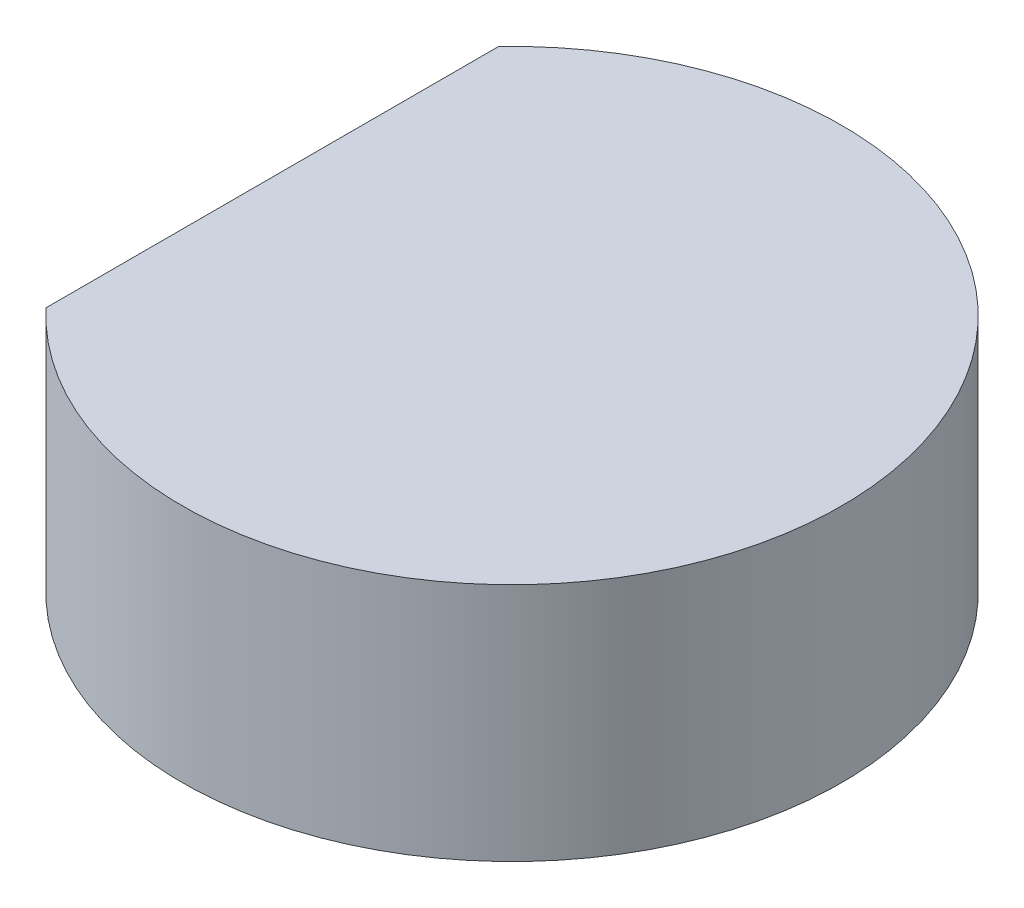
ISO-10303-21;
HEADER;
FILE_DESCRIPTION(('STEP AP214'),'2;1');
FILE_NAME('part.step','',(''),(''),'','','');
FILE_SCHEMA(('AUTOMOTIVE_DESIGN { 1 0 10303 214 1 1 1 1 }'));
ENDSEC;
DATA;
#1=APPLICATION_CONTEXT('core data for automotive mechanical design processes');
#2=APPLICATION_PROTOCOL_DEFINITION('international standard','automotive_design',2000,#1);
#3=PRODUCT_CONTEXT('',#1,'mechanical');
#4=PRODUCT('Part','Part','',(#3));
#5=PRODUCT_RELATED_PRODUCT_CATEGORY('part','',(#4));
#6=PRODUCT_DEFINITION_FORMATION('','',#4);
#7=PRODUCT_DEFINITION_CONTEXT('part definition',#1,'design');
#8=PRODUCT_DEFINITION('design','',#6,#7);
#9=PRODUCT_DEFINITION_SHAPE('','',#8);
#10=(LENGTH_UNIT() NAMED_UNIT(*) SI_UNIT(.MILLI.,.METRE.));
#11=(NAMED_UNIT(*) PLANE_ANGLE_UNIT() SI_UNIT($,.RADIAN.));
#12=(NAMED_UNIT(*) SI_UNIT($,.STERADIAN.) SOLID_ANGLE_UNIT());
#13=UNCERTAINTY_MEASURE_WITH_UNIT(LENGTH_MEASURE(1.E-05),#10,'distance_accuracy_value','');
#14=(GEOMETRIC_REPRESENTATION_CONTEXT(3) GLOBAL_UNCERTAINTY_ASSIGNED_CONTEXT((#13)) GLOBAL_UNIT_ASSIGNED_CONTEXT((#10,
#11,#12)) REPRESENTATION_CONTEXT('',''));
#15=CARTESIAN_POINT('',(0.,0.,0.));
#16=DIRECTION('',(0.,0.,1.));
#17=DIRECTION('',(1.,0.,0.));
#18=AXIS2_PLACEMENT_3D('',#15,#16,#17);
#19=CARTESIAN_POINT('',(0.,5.08,0.));
#20=DIRECTION('',(0.,-1.,0.));
#21=DIRECTION('',(0.,0.,-1.));
#22=AXIS2_PLACEMENT_3D('',#19,#20,#21);
#23=CYLINDRICAL_SURFACE('',#22,6.985);
#24=CARTESIAN_POINT('',(0.,5.08,0.));
#25=DIRECTION('',(0.,1.,0.));
#26=DIRECTION('',(0.,0.,1.));
#27=AXIS2_PLACEMENT_3D('',#24,#25,#26);
#28=CIRCLE('',#27,6.985);
#29=CARTESIAN_POINT('',(-5.08,5.08,4.79414486639693));
#30=VERTEX_POINT('',#29);
#31=CARTESIAN_POINT('',(-5.08,5.08,-4.79414486639693));
#32=VERTEX_POINT('',#31);
#33=EDGE_CURVE('E40',#30,#32,#28,.T.);
#34=ORIENTED_EDGE('',*,*,#33,.F.);
#35=DIRECTION('',(0.,-1.,0.));
#36=VECTOR('',#35,1.);
#37=CARTESIAN_POINT('',(-5.08,5.08,4.79414486639693));
#38=LINE('',#37,#36);
#39=CARTESIAN_POINT('',(-5.08,0.,4.79414486639693));
#40=VERTEX_POINT('',#39);
#41=EDGE_CURVE('E54',#30,#40,#38,.T.);
#42=ORIENTED_EDGE('',*,*,#41,.T.);
#43=CARTESIAN_POINT('',(0.,0.,0.));
#44=DIRECTION('',(0.,1.,0.));
#45=DIRECTION('',(0.,0.,1.));
#46=AXIS2_PLACEMENT_3D('',#43,#44,#45);
#47=CIRCLE('',#46,6.985);
#48=CARTESIAN_POINT('',(-5.08,0.,-4.79414486639693));
#49=VERTEX_POINT('',#48);
#50=EDGE_CURVE('E62',#40,#49,#47,.T.);
#51=ORIENTED_EDGE('',*,*,#50,.T.);
#52=DIRECTION('',(0.,-1.,0.));
#53=VECTOR('',#52,1.);
#54=CARTESIAN_POINT('',(-5.08,5.08,-4.79414486639693));
#55=LINE('',#54,#53);
#56=EDGE_CURVE('E47',#49,#32,#55,.F.);
#57=ORIENTED_EDGE('',*,*,#56,.T.);
#58=EDGE_LOOP('',(#34,#42,#51,#57));
#59=FACE_BOUND('',#58,.T.);
#60=ADVANCED_FACE('F33',(#59),#23,.T.);
#61=CARTESIAN_POINT('',(0.,5.08,0.));
#62=DIRECTION('',(0.,1.,0.));
#63=DIRECTION('',(0.,0.,1.));
#64=AXIS2_PLACEMENT_3D('',#61,#62,#63);
#65=PLANE('',#64);
#66=DIRECTION('',(0.,0.,-1.));
#67=VECTOR('',#66,1.);
#68=CARTESIAN_POINT('',(-5.08,5.08,6.35));
#69=LINE('',#68,#67);
#70=EDGE_CURVE('E57',#30,#32,#69,.T.);
#71=ORIENTED_EDGE('',*,*,#70,.F.);
#72=ORIENTED_EDGE('',*,*,#33,.T.);
#73=EDGE_LOOP('',(#71,#72));
#74=FACE_BOUND('',#73,.T.);
#75=ADVANCED_FACE('F66',(#74),#65,.T.);
#76=CARTESIAN_POINT('',(0.,0.,0.));
#77=DIRECTION('',(0.,1.,0.));
#78=DIRECTION('',(0.,0.,1.));
#79=AXIS2_PLACEMENT_3D('',#76,#77,#78);
#80=PLANE('',#79);
#81=ORIENTED_EDGE('',*,*,#50,.F.);
#82=DIRECTION('',(0.,0.,-1.));
#83=VECTOR('',#82,1.);
#84=CARTESIAN_POINT('',(-5.08,0.,0.));
#85=LINE('',#84,#83);
#86=EDGE_CURVE('E11',#40,#49,#85,.T.);
#87=ORIENTED_EDGE('',*,*,#86,.T.);
#88=EDGE_LOOP('',(#81,#87));
#89=FACE_BOUND('',#88,.T.);
#90=ADVANCED_FACE('F71',(#89),#80,.F.);
#91=CARTESIAN_POINT('',(-5.08,0.,6.35));
#92=DIRECTION('',(1.,0.,0.));
#93=DIRECTION('',(0.,0.,-1.));
#94=AXIS2_PLACEMENT_3D('',#91,#92,#93);
#95=PLANE('',#94);
#96=ORIENTED_EDGE('',*,*,#70,.T.);
#97=ORIENTED_EDGE('',*,*,#56,.F.);
#98=ORIENTED_EDGE('',*,*,#86,.F.);
#99=ORIENTED_EDGE('',*,*,#41,.F.);
#100=EDGE_LOOP('',(#96,#97,#98,#99));
#101=FACE_BOUND('',#100,.T.);
#102=ADVANCED_FACE('F56',(#101),#95,.F.);
#103=CLOSED_SHELL('',(#60,#75,#90,#102));
#104=MANIFOLD_SOLID_BREP('B2',#103);
#105=ADVANCED_BREP_SHAPE_REPRESENTATION('',(#18,#104),#14);
#106=SHAPE_DEFINITION_REPRESENTATION(#9,#105);
ENDSEC;
END-ISO-10303-21;
